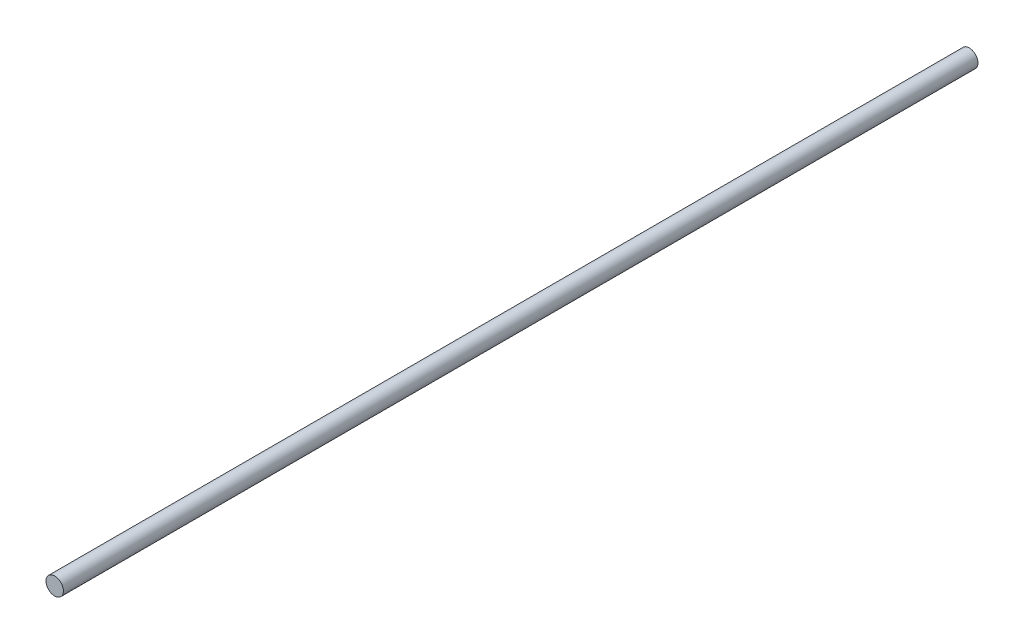
ISO-10303-21;
HEADER;
FILE_DESCRIPTION(('STEP AP214'),'2;1');
FILE_NAME('part.step','',(''),(''),'','','');
FILE_SCHEMA(('AUTOMOTIVE_DESIGN { 1 0 10303 214 1 1 1 1 }'));
ENDSEC;
DATA;
#1=APPLICATION_CONTEXT('core data for automotive mechanical design processes');
#2=APPLICATION_PROTOCOL_DEFINITION('international standard','automotive_design',2000,#1);
#3=PRODUCT_CONTEXT('',#1,'mechanical');
#4=PRODUCT('Part','Part','',(#3));
#5=PRODUCT_RELATED_PRODUCT_CATEGORY('part','',(#4));
#6=PRODUCT_DEFINITION_FORMATION('','',#4);
#7=PRODUCT_DEFINITION_CONTEXT('part definition',#1,'design');
#8=PRODUCT_DEFINITION('design','',#6,#7);
#9=PRODUCT_DEFINITION_SHAPE('','',#8);
#10=(LENGTH_UNIT() NAMED_UNIT(*) SI_UNIT(.MILLI.,.METRE.));
#11=(NAMED_UNIT(*) PLANE_ANGLE_UNIT() SI_UNIT($,.RADIAN.));
#12=(NAMED_UNIT(*) SI_UNIT($,.STERADIAN.) SOLID_ANGLE_UNIT());
#13=UNCERTAINTY_MEASURE_WITH_UNIT(LENGTH_MEASURE(1.E-05),#10,'distance_accuracy_value','');
#14=(GEOMETRIC_REPRESENTATION_CONTEXT(3) GLOBAL_UNCERTAINTY_ASSIGNED_CONTEXT((#13)) GLOBAL_UNIT_ASSIGNED_CONTEXT((#10,
#11,#12)) REPRESENTATION_CONTEXT('',''));
#15=CARTESIAN_POINT('',(0.,0.,0.));
#16=DIRECTION('',(0.,0.,1.));
#17=DIRECTION('',(1.,0.,0.));
#18=AXIS2_PLACEMENT_3D('',#15,#16,#17);
#19=CARTESIAN_POINT('',(0.,0.,210.));
#20=DIRECTION('',(0.,0.,-1.));
#21=DIRECTION('',(-1.,0.,0.));
#22=AXIS2_PLACEMENT_3D('',#19,#20,#21);
#23=CYLINDRICAL_SURFACE('',#22,4.);
#24=CARTESIAN_POINT('',(0.,0.,210.));
#25=DIRECTION('',(0.,0.,1.));
#26=DIRECTION('',(1.,0.,0.));
#27=AXIS2_PLACEMENT_3D('',#24,#25,#26);
#28=CIRCLE('',#27,4.);
#29=CARTESIAN_POINT('',(4.,0.,210.));
#30=VERTEX_POINT('',#29);
#31=EDGE_CURVE('E10',#30,#30,#28,.T.);
#32=ORIENTED_EDGE('',*,*,#31,.F.);
#33=EDGE_LOOP('',(#32));
#34=FACE_BOUND('',#33,.T.);
#35=CARTESIAN_POINT('',(0.,0.,-210.));
#36=DIRECTION('',(0.,0.,1.));
#37=DIRECTION('',(1.,0.,0.));
#38=AXIS2_PLACEMENT_3D('',#35,#36,#37);
#39=CIRCLE('',#38,4.);
#40=CARTESIAN_POINT('',(4.,0.,-210.));
#41=VERTEX_POINT('',#40);
#42=EDGE_CURVE('E34',#41,#41,#39,.T.);
#43=ORIENTED_EDGE('',*,*,#42,.T.);
#44=EDGE_LOOP('',(#43));
#45=FACE_BOUND('',#44,.T.);
#46=ADVANCED_FACE('F31',(#34,#45),#23,.T.);
#47=CARTESIAN_POINT('',(0.,0.,210.));
#48=DIRECTION('',(0.,0.,1.));
#49=DIRECTION('',(1.,0.,0.));
#50=AXIS2_PLACEMENT_3D('',#47,#48,#49);
#51=PLANE('',#50);
#52=ORIENTED_EDGE('',*,*,#31,.T.);
#53=EDGE_LOOP('',(#52));
#54=FACE_BOUND('',#53,.T.);
#55=ADVANCED_FACE('F46',(#54),#51,.T.);
#56=CARTESIAN_POINT('',(0.,0.,-210.));
#57=DIRECTION('',(0.,0.,1.));
#58=DIRECTION('',(1.,0.,0.));
#59=AXIS2_PLACEMENT_3D('',#56,#57,#58);
#60=PLANE('',#59);
#61=ORIENTED_EDGE('',*,*,#42,.F.);
#62=EDGE_LOOP('',(#61));
#63=FACE_BOUND('',#62,.T.);
#64=ADVANCED_FACE('F44',(#63),#60,.F.);
#65=CLOSED_SHELL('',(#46,#55,#64));
#66=MANIFOLD_SOLID_BREP('B2',#65);
#67=ADVANCED_BREP_SHAPE_REPRESENTATION('',(#18,#66),#14);
#68=SHAPE_DEFINITION_REPRESENTATION(#9,#67);
ENDSEC;
END-ISO-10303-21;
